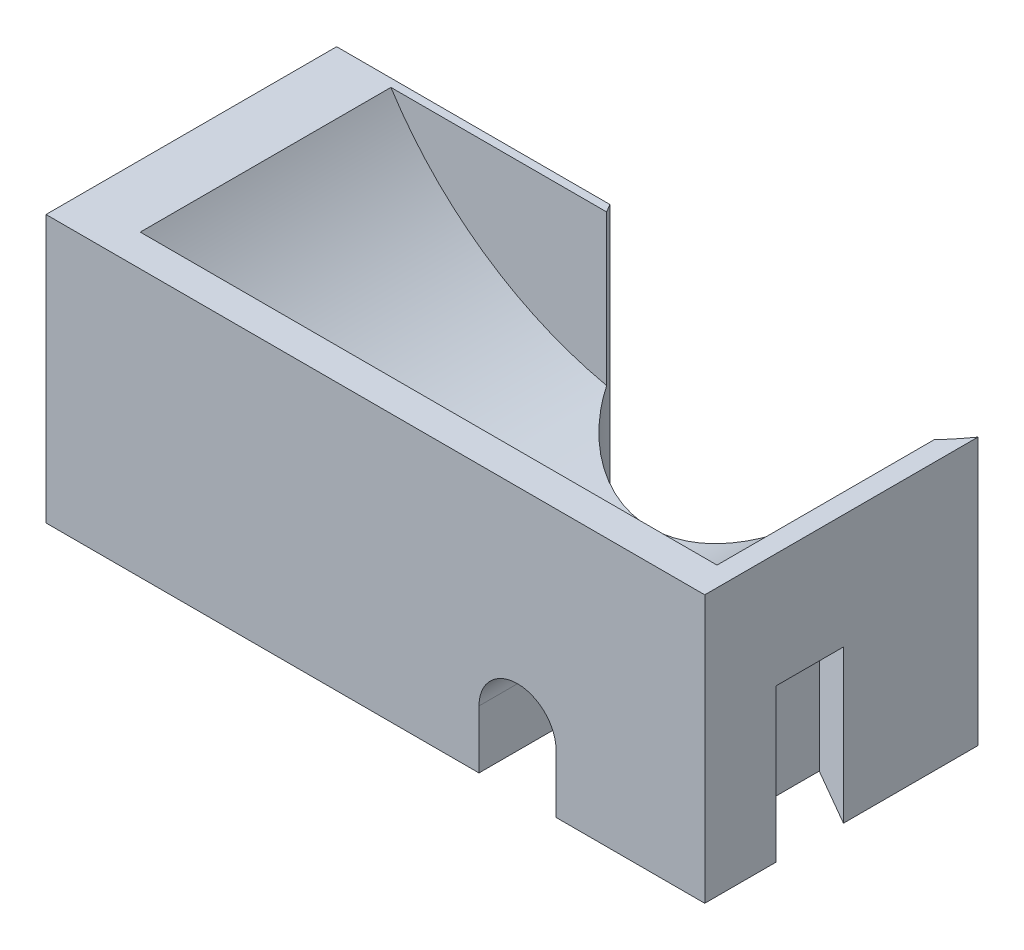
ISO-10303-21;
HEADER;
FILE_DESCRIPTION(('STEP AP214'),'2;1');
FILE_NAME('part.step','',(''),(''),'','','');
FILE_SCHEMA(('AUTOMOTIVE_DESIGN { 1 0 10303 214 1 1 1 1 }'));
ENDSEC;
DATA;
#1=APPLICATION_CONTEXT('core data for automotive mechanical design processes');
#2=APPLICATION_PROTOCOL_DEFINITION('international standard','automotive_design',2000,#1);
#3=PRODUCT_CONTEXT('',#1,'mechanical');
#4=PRODUCT('Part','Part','',(#3));
#5=PRODUCT_RELATED_PRODUCT_CATEGORY('part','',(#4));
#6=PRODUCT_DEFINITION_FORMATION('','',#4);
#7=PRODUCT_DEFINITION_CONTEXT('part definition',#1,'design');
#8=PRODUCT_DEFINITION('design','',#6,#7);
#9=PRODUCT_DEFINITION_SHAPE('','',#8);
#10=(LENGTH_UNIT() NAMED_UNIT(*) SI_UNIT(.MILLI.,.METRE.));
#11=(NAMED_UNIT(*) PLANE_ANGLE_UNIT() SI_UNIT($,.RADIAN.));
#12=(NAMED_UNIT(*) SI_UNIT($,.STERADIAN.) SOLID_ANGLE_UNIT());
#13=UNCERTAINTY_MEASURE_WITH_UNIT(LENGTH_MEASURE(1.E-05),#10,'distance_accuracy_value','');
#14=(GEOMETRIC_REPRESENTATION_CONTEXT(3) GLOBAL_UNCERTAINTY_ASSIGNED_CONTEXT((#13)) GLOBAL_UNIT_ASSIGNED_CONTEXT((#10,
#11,#12)) REPRESENTATION_CONTEXT('',''));
#15=CARTESIAN_POINT('',(0.,0.,0.));
#16=DIRECTION('',(0.,0.,1.));
#17=DIRECTION('',(1.,0.,0.));
#18=AXIS2_PLACEMENT_3D('',#15,#16,#17);
#19=CARTESIAN_POINT('',(219.202,88.9,-4.60248000000001));
#20=DIRECTION('',(-1.,0.,0.));
#21=DIRECTION('',(0.,0.,1.));
#22=AXIS2_PLACEMENT_3D('',#19,#20,#21);
#23=PLANE('',#22);
#24=DIRECTION('',(0.,0.,-1.));
#25=VECTOR('',#24,1.);
#26=CARTESIAN_POINT('',(219.202,0.,0.));
#27=LINE('',#26,#25);
#28=CARTESIAN_POINT('',(219.202,0.,-37.62248));
#29=VERTEX_POINT('',#28);
#30=CARTESIAN_POINT('',(219.202,0.,-61.3210026280625));
#31=VERTEX_POINT('',#30);
#32=EDGE_CURVE('E47',#29,#31,#27,.T.);
#33=ORIENTED_EDGE('',*,*,#32,.T.);
#34=DIRECTION('',(0.,1.,0.));
#35=VECTOR('',#34,1.);
#36=CARTESIAN_POINT('',(219.202,-12.7,-61.3210026280625));
#37=LINE('',#36,#35);
#38=CARTESIAN_POINT('',(219.202,50.8,-61.3210026280625));
#39=VERTEX_POINT('',#38);
#40=EDGE_CURVE('E11',#31,#39,#37,.T.);
#41=ORIENTED_EDGE('',*,*,#40,.T.);
#42=DIRECTION('',(0.,0.,1.));
#43=VECTOR('',#42,1.);
#44=CARTESIAN_POINT('',(219.202,50.8,-4.60248000000001));
#45=LINE('',#44,#43);
#46=CARTESIAN_POINT('',(219.202,50.8,-83.7739573719375));
#47=VERTEX_POINT('',#46);
#48=EDGE_CURVE('E58',#47,#39,#45,.T.);
#49=ORIENTED_EDGE('',*,*,#48,.F.);
#50=DIRECTION('',(0.,1.,0.));
#51=VECTOR('',#50,1.);
#52=CARTESIAN_POINT('',(219.202,88.9,-83.7739573719375));
#53=LINE('',#52,#51);
#54=CARTESIAN_POINT('',(219.202,0.,-83.7739573719375));
#55=VERTEX_POINT('',#54);
#56=EDGE_CURVE('E250',#55,#47,#53,.T.);
#57=ORIENTED_EDGE('',*,*,#56,.F.);
#58=CARTESIAN_POINT('',(219.202,0.,-128.546480448172));
#59=VERTEX_POINT('',#58);
#60=EDGE_CURVE('E338',#55,#59,#27,.T.);
#61=ORIENTED_EDGE('',*,*,#60,.T.);
#62=DIRECTION('',(0.,1.,0.));
#63=VECTOR('',#62,1.);
#64=CARTESIAN_POINT('',(219.202,-12.7,-128.546480448172));
#65=LINE('',#64,#63);
#66=CARTESIAN_POINT('',(219.202,50.8,-128.546480448172));
#67=VERTEX_POINT('',#66);
#68=EDGE_CURVE('E327',#67,#59,#65,.F.);
#69=ORIENTED_EDGE('',*,*,#68,.F.);
#70=CARTESIAN_POINT('',(219.202,88.9,-128.546480448172));
#71=VERTEX_POINT('',#70);
#72=EDGE_CURVE('E332',#71,#67,#65,.F.);
#73=ORIENTED_EDGE('',*,*,#72,.F.);
#74=DIRECTION('',(0.,0.,-1.));
#75=VECTOR('',#74,1.);
#76=CARTESIAN_POINT('',(219.202,88.9,0.));
#77=LINE('',#76,#75);
#78=CARTESIAN_POINT('',(219.202,88.9,-37.62248));
#79=VERTEX_POINT('',#78);
#80=EDGE_CURVE('E310',#79,#71,#77,.T.);
#81=ORIENTED_EDGE('',*,*,#80,.F.);
#82=DIRECTION('',(0.,1.,0.));
#83=VECTOR('',#82,1.);
#84=CARTESIAN_POINT('',(219.202,88.9,-37.62248));
#85=LINE('',#84,#83);
#86=CARTESIAN_POINT('',(219.202,50.8,-37.62248));
#87=VERTEX_POINT('',#86);
#88=EDGE_CURVE('E387',#87,#79,#85,.T.);
#89=ORIENTED_EDGE('',*,*,#88,.F.);
#90=EDGE_CURVE('E388',#29,#87,#85,.T.);
#91=ORIENTED_EDGE('',*,*,#90,.F.);
#92=EDGE_LOOP('',(#33,#41,#49,#57,#61,#69,#73,#81,#89,#91));
#93=FACE_BOUND('',#92,.T.);
#94=ADVANCED_FACE('F43',(#93),#23,.F.);
#95=CARTESIAN_POINT('',(0.,50.8,0.));
#96=DIRECTION('',(0.,-1.,0.));
#97=DIRECTION('',(0.,0.,-1.));
#98=AXIS2_PLACEMENT_3D('',#95,#96,#97);
#99=PLANE('',#98);
#100=DIRECTION('',(0.,0.,1.));
#101=VECTOR('',#100,1.);
#102=CARTESIAN_POINT('',(200.152,50.8,-94.77248));
#103=LINE('',#102,#101);
#104=CARTESIAN_POINT('',(200.152,50.8,-94.77248));
#105=VERTEX_POINT('',#104);
#106=CARTESIAN_POINT('',(200.152,50.8,-50.32248));
#107=VERTEX_POINT('',#106);
#108=EDGE_CURVE('E347',#105,#107,#103,.T.);
#109=ORIENTED_EDGE('',*,*,#108,.F.);
#110=DIRECTION('',(-0.866025403784436,0.,-0.500000000000004));
#111=VECTOR('',#110,1.);
#112=CARTESIAN_POINT('',(200.152,50.8,-94.77248));
#113=LINE('',#112,#111);
#114=EDGE_CURVE('E343',#47,#105,#113,.T.);
#115=ORIENTED_EDGE('',*,*,#114,.F.);
#116=ORIENTED_EDGE('',*,*,#48,.T.);
#117=DIRECTION('',(0.866025403784436,0.,-0.500000000000004));
#118=VECTOR('',#117,1.);
#119=CARTESIAN_POINT('',(200.152,50.8,-50.32248));
#120=LINE('',#119,#118);
#121=EDGE_CURVE('E341',#107,#39,#120,.T.);
#122=ORIENTED_EDGE('',*,*,#121,.F.);
#123=EDGE_LOOP('',(#109,#115,#116,#122));
#124=FACE_BOUND('',#123,.T.);
#125=ADVANCED_FACE('F45',(#124),#99,.T.);
#126=CARTESIAN_POINT('',(200.152,-12.7,-50.32248));
#127=DIRECTION('',(-0.500000000000004,0.,-0.866025403784436));
#128=DIRECTION('',(-0.866025403784436,0.,0.500000000000004));
#129=AXIS2_PLACEMENT_3D('',#126,#127,#128);
#130=PLANE('',#129);
#131=DIRECTION('',(0.866025403784436,0.,-0.500000000000004));
#132=VECTOR('',#131,1.);
#133=CARTESIAN_POINT('',(28.2477269692836,0.,48.9264983091322));
#134=LINE('',#133,#132);
#135=CARTESIAN_POINT('',(200.152,0.,-50.32248));
#136=VERTEX_POINT('',#135);
#137=EDGE_CURVE('E328',#136,#31,#134,.T.);
#138=ORIENTED_EDGE('',*,*,#137,.F.);
#139=DIRECTION('',(0.,1.,0.));
#140=VECTOR('',#139,1.);
#141=CARTESIAN_POINT('',(200.152,-12.7,-50.32248));
#142=LINE('',#141,#140);
#143=EDGE_CURVE('E348',#136,#107,#142,.T.);
#144=ORIENTED_EDGE('',*,*,#143,.T.);
#145=ORIENTED_EDGE('',*,*,#121,.T.);
#146=ORIENTED_EDGE('',*,*,#40,.F.);
#147=EDGE_LOOP('',(#138,#144,#145,#146));
#148=FACE_BOUND('',#147,.T.);
#149=ADVANCED_FACE('F433',(#148),#130,.T.);
#150=CARTESIAN_POINT('',(200.152,-12.7,-94.77248));
#151=DIRECTION('',(-0.500000000000004,0.,0.866025403784436));
#152=DIRECTION('',(0.866025403784436,0.,0.500000000000004));
#153=AXIS2_PLACEMENT_3D('',#150,#151,#152);
#154=PLANE('',#153);
#155=DIRECTION('',(-0.866025403784436,0.,-0.500000000000004));
#156=VECTOR('',#155,1.);
#157=CARTESIAN_POINT('',(91.0756876298274,0.,-157.747718309132));
#158=LINE('',#157,#156);
#159=CARTESIAN_POINT('',(200.152,0.,-94.77248));
#160=VERTEX_POINT('',#159);
#161=EDGE_CURVE('E335',#55,#160,#158,.T.);
#162=ORIENTED_EDGE('',*,*,#161,.F.);
#163=ORIENTED_EDGE('',*,*,#56,.T.);
#164=ORIENTED_EDGE('',*,*,#114,.T.);
#165=DIRECTION('',(0.,1.,0.));
#166=VECTOR('',#165,1.);
#167=CARTESIAN_POINT('',(200.152,-12.7,-94.77248));
#168=LINE('',#167,#166);
#169=EDGE_CURVE('E355',#160,#105,#168,.T.);
#170=ORIENTED_EDGE('',*,*,#169,.F.);
#171=EDGE_LOOP('',(#162,#163,#164,#170));
#172=FACE_BOUND('',#171,.T.);
#173=ADVANCED_FACE('F439',(#172),#154,.T.);
#174=CARTESIAN_POINT('',(200.152,-12.7,-94.77248));
#175=DIRECTION('',(1.,0.,0.));
#176=DIRECTION('',(0.,0.,-1.));
#177=AXIS2_PLACEMENT_3D('',#174,#175,#176);
#178=PLANE('',#177);
#179=DIRECTION('',(0.,0.,1.));
#180=VECTOR('',#179,1.);
#181=CARTESIAN_POINT('',(200.152,0.,0.));
#182=LINE('',#181,#180);
#183=EDGE_CURVE('E331',#160,#136,#182,.T.);
#184=ORIENTED_EDGE('',*,*,#183,.F.);
#185=ORIENTED_EDGE('',*,*,#169,.T.);
#186=ORIENTED_EDGE('',*,*,#108,.T.);
#187=ORIENTED_EDGE('',*,*,#143,.F.);
#188=EDGE_LOOP('',(#184,#185,#186,#187));
#189=FACE_BOUND('',#188,.T.);
#190=ADVANCED_FACE('F437',(#189),#178,.T.);
#191=CARTESIAN_POINT('',(0.,50.8,-134.33298));
#192=DIRECTION('',(0.,1.,0.));
#193=DIRECTION('',(0.,0.,1.));
#194=AXIS2_PLACEMENT_3D('',#191,#192,#193);
#195=PLANE('',#194);
#196=DIRECTION('',(-0.866025403784436,0.,0.500000000000004));
#197=VECTOR('',#196,1.);
#198=CARTESIAN_POINT('',(14.7024148251115,50.8,-108.867650528953));
#199=LINE('',#198,#197);
#200=CARTESIAN_POINT('',(19.05,50.8,-111.37773));
#201=VERTEX_POINT('',#200);
#202=CARTESIAN_POINT('',(0.,50.8,-100.379207371938));
#203=VERTEX_POINT('',#202);
#204=EDGE_CURVE('E224',#201,#203,#199,.T.);
#205=ORIENTED_EDGE('',*,*,#204,.F.);
#206=DIRECTION('',(0.,0.,-1.));
#207=VECTOR('',#206,1.);
#208=CARTESIAN_POINT('',(19.05,50.8,-134.33298));
#209=LINE('',#208,#207);
#210=CARTESIAN_POINT('',(19.05,50.8,-60.57773));
#211=VERTEX_POINT('',#210);
#212=EDGE_CURVE('E242',#211,#201,#209,.T.);
#213=ORIENTED_EDGE('',*,*,#212,.F.);
#214=DIRECTION('',(0.866025403784436,0.,0.500000000000004));
#215=VECTOR('',#214,1.);
#216=CARTESIAN_POINT('',(-27.1744600812362,50.8,-87.2654344710471));
#217=LINE('',#216,#215);
#218=CARTESIAN_POINT('',(0.,50.8,-71.5762526280625));
#219=VERTEX_POINT('',#218);
#220=EDGE_CURVE('E246',#219,#211,#217,.T.);
#221=ORIENTED_EDGE('',*,*,#220,.F.);
#222=DIRECTION('',(0.,0.,1.));
#223=VECTOR('',#222,1.);
#224=CARTESIAN_POINT('',(0.,50.8,-37.62248));
#225=LINE('',#224,#223);
#226=EDGE_CURVE('E234',#203,#219,#225,.T.);
#227=ORIENTED_EDGE('',*,*,#226,.F.);
#228=EDGE_LOOP('',(#205,#213,#221,#227));
#229=FACE_BOUND('',#228,.T.);
#230=ADVANCED_FACE('F275',(#229),#195,.F.);
#231=CARTESIAN_POINT('',(19.05,-12.7,-111.37773));
#232=DIRECTION('',(-0.500000000000004,0.,-0.866025403784436));
#233=DIRECTION('',(-0.866025403784436,0.,0.500000000000004));
#234=AXIS2_PLACEMENT_3D('',#231,#232,#233);
#235=PLANE('',#234);
#236=DIRECTION('',(0.866025403784436,0.,-0.500000000000004));
#237=VECTOR('',#236,1.);
#238=CARTESIAN_POINT('',(-43.4654717979223,0.,-75.2844055289527));
#239=LINE('',#238,#237);
#240=CARTESIAN_POINT('',(0.,0.,-100.379207371938));
#241=VERTEX_POINT('',#240);
#242=CARTESIAN_POINT('',(19.05,0.,-111.37773));
#243=VERTEX_POINT('',#242);
#244=EDGE_CURVE('E303',#241,#243,#239,.T.);
#245=ORIENTED_EDGE('',*,*,#244,.T.);
#246=DIRECTION('',(0.,1.,0.));
#247=VECTOR('',#246,1.);
#248=CARTESIAN_POINT('',(19.05,-12.7,-111.37773));
#249=LINE('',#248,#247);
#250=EDGE_CURVE('E311',#243,#201,#249,.T.);
#251=ORIENTED_EDGE('',*,*,#250,.T.);
#252=ORIENTED_EDGE('',*,*,#204,.T.);
#253=DIRECTION('',(0.,1.,0.));
#254=VECTOR('',#253,1.);
#255=CARTESIAN_POINT('',(0.,-12.7,-100.379207371938));
#256=LINE('',#255,#254);
#257=EDGE_CURVE('E308',#241,#203,#256,.T.);
#258=ORIENTED_EDGE('',*,*,#257,.F.);
#259=EDGE_LOOP('',(#245,#251,#252,#258));
#260=FACE_BOUND('',#259,.T.);
#261=ADVANCED_FACE('F462',(#260),#235,.F.);
#262=CARTESIAN_POINT('',(19.05,-12.7,-60.57773));
#263=DIRECTION('',(1.,0.,0.));
#264=DIRECTION('',(0.,0.,-1.));
#265=AXIS2_PLACEMENT_3D('',#262,#263,#264);
#266=PLANE('',#265);
#267=DIRECTION('',(0.,0.,1.));
#268=VECTOR('',#267,1.);
#269=CARTESIAN_POINT('',(19.05,0.,0.));
#270=LINE('',#269,#268);
#271=CARTESIAN_POINT('',(19.05,0.,-60.57773));
#272=VERTEX_POINT('',#271);
#273=EDGE_CURVE('E301',#243,#272,#270,.T.);
#274=ORIENTED_EDGE('',*,*,#273,.T.);
#275=DIRECTION('',(0.,1.,0.));
#276=VECTOR('',#275,1.);
#277=CARTESIAN_POINT('',(19.05,-12.7,-60.57773));
#278=LINE('',#277,#276);
#279=EDGE_CURVE('E313',#272,#211,#278,.T.);
#280=ORIENTED_EDGE('',*,*,#279,.T.);
#281=ORIENTED_EDGE('',*,*,#212,.T.);
#282=ORIENTED_EDGE('',*,*,#250,.F.);
#283=EDGE_LOOP('',(#274,#280,#281,#282));
#284=FACE_BOUND('',#283,.T.);
#285=ADVANCED_FACE('F458',(#284),#266,.F.);
#286=CARTESIAN_POINT('',(0.,-12.7,-71.5762526280625));
#287=DIRECTION('',(-0.500000000000004,0.,0.866025403784436));
#288=DIRECTION('',(0.866025403784436,0.,0.500000000000004));
#289=AXIS2_PLACEMENT_3D('',#286,#287,#288);
#290=PLANE('',#289);
#291=DIRECTION('',(-0.866025403784436,0.,-0.500000000000004));
#292=VECTOR('',#291,1.);
#293=CARTESIAN_POINT('',(30.9934265417976,0.,-53.6821894710466));
#294=LINE('',#293,#292);
#295=CARTESIAN_POINT('',(0.,0.,-71.5762526280625));
#296=VERTEX_POINT('',#295);
#297=EDGE_CURVE('E298',#272,#296,#294,.T.);
#298=ORIENTED_EDGE('',*,*,#297,.T.);
#299=DIRECTION('',(0.,1.,0.));
#300=VECTOR('',#299,1.);
#301=CARTESIAN_POINT('',(0.,-12.7,-71.5762526280625));
#302=LINE('',#301,#300);
#303=EDGE_CURVE('E296',#296,#219,#302,.T.);
#304=ORIENTED_EDGE('',*,*,#303,.T.);
#305=ORIENTED_EDGE('',*,*,#220,.T.);
#306=ORIENTED_EDGE('',*,*,#279,.F.);
#307=EDGE_LOOP('',(#298,#304,#305,#306));
#308=FACE_BOUND('',#307,.T.);
#309=ADVANCED_FACE('F455',(#308),#290,.F.);
#310=CARTESIAN_POINT('',(0.,0.,0.));
#311=DIRECTION('',(0.,-1.,0.));
#312=DIRECTION('',(0.,0.,-1.));
#313=AXIS2_PLACEMENT_3D('',#310,#311,#312);
#314=PLANE('',#313);
#315=DIRECTION('',(0.,0.,1.));
#316=VECTOR('',#315,1.);
#317=CARTESIAN_POINT('',(0.,0.,0.));
#318=LINE('',#317,#316);
#319=CARTESIAN_POINT('',(0.,0.,-134.33298));
#320=VERTEX_POINT('',#319);
#321=EDGE_CURVE('E305',#320,#241,#318,.T.);
#322=ORIENTED_EDGE('',*,*,#321,.F.);
#323=DIRECTION('',(-1.,0.,0.));
#324=VECTOR('',#323,1.);
#325=CARTESIAN_POINT('',(419.1,0.,-134.33298));
#326=LINE('',#325,#324);
#327=CARTESIAN_POINT('',(90.9178858384925,0.,-134.33298));
#328=VERTEX_POINT('',#327);
#329=EDGE_CURVE('E391',#328,#320,#326,.T.);
#330=ORIENTED_EDGE('',*,*,#329,.F.);
#331=CARTESIAN_POINT('',(156.909021606867,0.,-172.43298));
#332=DIRECTION('',(0.,-1.,0.));
#333=DIRECTION('',(0.,0.,-1.));
#334=AXIS2_PLACEMENT_3D('',#331,#332,#333);
#335=CIRCLE('',#334,76.2);
#336=CARTESIAN_POINT('',(144.082021606867,0.,-97.3203441056313));
#337=VERTEX_POINT('',#336);
#338=EDGE_CURVE('E370',#337,#328,#335,.T.);
#339=ORIENTED_EDGE('',*,*,#338,.F.);
#340=DIRECTION('',(0.,0.,-1.));
#341=VECTOR('',#340,1.);
#342=CARTESIAN_POINT('',(144.082021606867,0.,33.9832349236573));
#343=LINE('',#342,#341);
#344=CARTESIAN_POINT('',(144.082021606867,0.,-37.62248));
#345=VERTEX_POINT('',#344);
#346=EDGE_CURVE('E380',#345,#337,#343,.T.);
#347=ORIENTED_EDGE('',*,*,#346,.F.);
#348=DIRECTION('',(1.,0.,0.));
#349=VECTOR('',#348,1.);
#350=CARTESIAN_POINT('',(0.,0.,-37.62248));
#351=LINE('',#350,#349);
#352=CARTESIAN_POINT('',(0.,0.,-37.62248));
#353=VERTEX_POINT('',#352);
#354=EDGE_CURVE('E385',#353,#345,#351,.T.);
#355=ORIENTED_EDGE('',*,*,#354,.F.);
#356=DIRECTION('',(0.,0.,1.));
#357=VECTOR('',#356,1.);
#358=CARTESIAN_POINT('',(0.,0.,0.));
#359=LINE('',#358,#357);
#360=EDGE_CURVE('E297',#296,#353,#359,.T.);
#361=ORIENTED_EDGE('',*,*,#360,.F.);
#362=ORIENTED_EDGE('',*,*,#297,.F.);
#363=ORIENTED_EDGE('',*,*,#273,.F.);
#364=ORIENTED_EDGE('',*,*,#244,.F.);
#365=EDGE_LOOP('',(#322,#330,#339,#347,#355,#361,#362,#363,#364));
#366=FACE_BOUND('',#365,.T.);
#367=ADVANCED_FACE('F418',(#366),#314,.T.);
#368=CARTESIAN_POINT('',(144.082021606867,0.,33.9832349236573));
#369=DIRECTION('',(-1.,0.,0.));
#370=DIRECTION('',(0.,0.,1.));
#371=AXIS2_PLACEMENT_3D('',#368,#369,#370);
#372=PLANE('',#371);
#373=ORIENTED_EDGE('',*,*,#346,.T.);
#374=DIRECTION('',(0.,1.,0.));
#375=VECTOR('',#374,1.);
#376=CARTESIAN_POINT('',(144.082021606867,-12.7,-97.3203441056313));
#377=LINE('',#376,#375);
#378=CARTESIAN_POINT('',(144.082021606867,19.3163774202701,-97.3203441056313));
#379=VERTEX_POINT('',#378);
#380=EDGE_CURVE('E263',#337,#379,#377,.T.);
#381=ORIENTED_EDGE('',*,*,#380,.T.);
#382=DIRECTION('',(0.,0.,-1.));
#383=VECTOR('',#382,1.);
#384=CARTESIAN_POINT('',(144.082021606867,19.3163774202701,33.9832349236573));
#385=LINE('',#384,#383);
#386=CARTESIAN_POINT('',(144.082021606867,19.3163774202701,-37.62248));
#387=VERTEX_POINT('',#386);
#388=EDGE_CURVE('E377',#387,#379,#385,.T.);
#389=ORIENTED_EDGE('',*,*,#388,.F.);
#390=DIRECTION('',(0.,-1.,0.));
#391=VECTOR('',#390,1.);
#392=CARTESIAN_POINT('',(144.082021606867,0.,-37.62248));
#393=LINE('',#392,#391);
#394=EDGE_CURVE('E396',#387,#345,#393,.T.);
#395=ORIENTED_EDGE('',*,*,#394,.T.);
#396=EDGE_LOOP('',(#373,#381,#389,#395));
#397=FACE_BOUND('',#396,.T.);
#398=ADVANCED_FACE('F411',(#397),#372,.F.);
#399=CARTESIAN_POINT('',(156.909021606867,19.3163774202701,33.9832349236573));
#400=DIRECTION('',(0.,0.,-1.));
#401=DIRECTION('',(-1.,0.,0.));
#402=AXIS2_PLACEMENT_3D('',#399,#400,#401);
#403=CYLINDRICAL_SURFACE('',#402,12.827);
#404=ORIENTED_EDGE('',*,*,#388,.T.);
#405=CARTESIAN_POINT('',(144.082021606867,19.3163774202701,-97.3203441056313));
#406=CARTESIAN_POINT('',(144.081980002003,19.674417318807,-97.3203706950546));
#407=CARTESIAN_POINT('',(144.0970107518,20.0324477808746,-97.3177850017572));
#408=CARTESIAN_POINT('',(144.156913806363,20.7458963548096,-97.3075818232591));
#409=CARTESIAN_POINT('',(144.201783092249,21.1013147272746,-97.2999648470934));
#410=CARTESIAN_POINT('',(144.320983685887,21.8065665506759,-97.2799046767254));
#411=CARTESIAN_POINT('',(144.395277131997,22.1564065801217,-97.2674676851347));
#412=CARTESIAN_POINT('',(144.57274509734,22.8484886445516,-97.2381369776627));
#413=CARTESIAN_POINT('',(144.675919594239,23.1907306854114,-97.2212432652281));
#414=CARTESIAN_POINT('',(144.910400846502,23.8652852493027,-97.1834804928675));
#415=CARTESIAN_POINT('',(145.041713165892,24.1975957936311,-97.1626106467844));
#416=CARTESIAN_POINT('',(145.331491900473,24.849921657921,-97.1174948904797));
#417=CARTESIAN_POINT('',(145.489958609173,25.1699368449382,-97.0932489437671));
#418=CARTESIAN_POINT('',(145.832905135481,25.7954826165946,-97.0420675206401));
#419=CARTESIAN_POINT('',(146.017384928444,26.1010132149562,-97.0151320467739));
#420=CARTESIAN_POINT('',(146.411059133808,26.6955251645597,-96.9593270390223));
#421=CARTESIAN_POINT('',(146.620253627969,26.9845064610502,-96.9304574987391));
#422=CARTESIAN_POINT('',(147.063879195269,27.5464677264759,-96.8713252255254));
#423=CARTESIAN_POINT('',(147.298518137886,27.8192825563055,-96.841052386714));
#424=CARTESIAN_POINT('',(147.789860293263,28.3442273487511,-96.7802063602077));
#425=CARTESIAN_POINT('',(148.04656366612,28.5963571612547,-96.7496331703351));
#426=CARTESIAN_POINT('',(148.580314956433,29.0782351957301,-96.6890378095051));
#427=CARTESIAN_POINT('',(148.857365957908,29.3079800125601,-96.6590157229421));
#428=CARTESIAN_POINT('',(149.429884378414,29.7434473754043,-96.60036634391));
#429=CARTESIAN_POINT('',(149.725351821388,29.9491698901865,-96.5717390532544));
#430=CARTESIAN_POINT('',(150.334531174701,30.3363156833559,-96.5165116787527));
#431=CARTESIAN_POINT('',(150.648343272254,30.5175832822997,-96.4899250082875));
#432=CARTESIAN_POINT('',(151.290368896252,30.8530080850057,-96.4397276326144));
#433=CARTESIAN_POINT('',(151.618582500754,31.0071651418069,-96.416116943539));
#434=CARTESIAN_POINT('',(152.287054101712,31.2872023059767,-96.3725462783224));
#435=CARTESIAN_POINT('',(152.627310791014,31.4130854713607,-96.3525859074177));
#436=CARTESIAN_POINT('',(153.31746406319,31.63563466525,-96.316883839556));
#437=CARTESIAN_POINT('',(153.667360546471,31.7323009954817,-96.3011420990327));
#438=CARTESIAN_POINT('',(154.370934479109,31.894897997159,-96.2744553628301));
#439=CARTESIAN_POINT('',(154.724545519948,31.9611089043888,-96.2634666901631));
#440=CARTESIAN_POINT('',(155.436195289238,32.0636103170679,-96.2463836879321));
#441=CARTESIAN_POINT('',(155.79423399294,32.0999009896953,-96.2402893310215));
#442=CARTESIAN_POINT('',(156.51213140006,32.1422768464238,-96.2331681297441));
#443=CARTESIAN_POINT('',(156.871990035173,32.1483631558581,-96.2321410965825));
#444=CARTESIAN_POINT('',(157.5909238785,32.1302852698232,-96.2351832737623));
#445=CARTESIAN_POINT('',(157.949999090984,32.1061212396345,-96.2392524562591));
#446=CARTESIAN_POINT('',(158.661136806694,32.0281308598088,-96.2523046863911));
#447=CARTESIAN_POINT('',(159.013233501978,31.9746074116959,-96.2612375485186));
#448=CARTESIAN_POINT('',(159.711614043232,31.8385165137609,-96.2837348258339));
#449=CARTESIAN_POINT('',(160.057897934885,31.7559492923077,-96.2972992046043));
#450=CARTESIAN_POINT('',(160.742233703808,31.5623915697681,-96.3286843067033));
#451=CARTESIAN_POINT('',(161.080285463097,31.4514006615825,-96.3465050909942));
#452=CARTESIAN_POINT('',(161.745814117451,31.2018170490258,-96.3859118604959));
#453=CARTESIAN_POINT('',(162.073290938018,31.0632241502532,-96.4074978722253));
#454=CARTESIAN_POINT('',(162.716932138441,30.7587305001128,-96.4539514333826));
#455=CARTESIAN_POINT('',(163.03303648369,30.5927051285241,-96.4788338504528));
#456=CARTESIAN_POINT('',(163.650156524544,30.2349959107583,-96.5311156634102));
#457=CARTESIAN_POINT('',(163.951172186216,30.0433120068828,-96.5585150649573));
#458=CARTESIAN_POINT('',(164.536092759522,29.635621816494,-96.6150788316126));
#459=CARTESIAN_POINT('',(164.819997103327,29.4196147235119,-96.6442432552278));
#460=CARTESIAN_POINT('',(165.36877837883,28.9647689358276,-96.7035359049911));
#461=CARTESIAN_POINT('',(165.63365517885,28.7259300831471,-96.7336641378071));
#462=CARTESIAN_POINT('',(166.145724271424,28.2239788929368,-96.7944274654638));
#463=CARTESIAN_POINT('',(166.392659842595,27.9606047884149,-96.8250642450063));
#464=CARTESIAN_POINT('',(166.863500675014,27.4139334601393,-96.8856126991821));
#465=CARTESIAN_POINT('',(167.087405572806,27.1306359220837,-96.9155243623662));
#466=CARTESIAN_POINT('',(167.510674621852,26.545980759162,-96.9737816043461));
#467=CARTESIAN_POINT('',(167.710031384919,26.2446177375523,-97.0021267102514));
#468=CARTESIAN_POINT('',(168.082695047787,25.6259999752959,-97.0564286392203));
#469=CARTESIAN_POINT('',(168.256002781154,25.3087457435989,-97.0823855386959));
#470=CARTESIAN_POINT('',(168.575593747722,24.6599731149103,-97.1312052003055));
#471=CARTESIAN_POINT('',(168.721828665921,24.3284304934294,-97.1540624115648));
#472=CARTESIAN_POINT('',(168.985796829473,23.6539539872622,-97.1959587034029));
#473=CARTESIAN_POINT('',(169.103530520491,23.3110202807909,-97.2149978436831));
#474=CARTESIAN_POINT('',(169.309467864939,22.6166571966926,-97.2486743409765));
#475=CARTESIAN_POINT('',(169.397708038198,22.2652389077223,-97.2633171393788));
#476=CARTESIAN_POINT('',(169.544138937871,21.5561767011553,-97.2877916830802));
#477=CARTESIAN_POINT('',(169.60234407763,21.1985358550043,-97.2976257359023));
#478=CARTESIAN_POINT('',(169.675543087503,20.5862954971143,-97.3100349567253));
#479=CARTESIAN_POINT('',(169.698234550896,20.3326153768816,-97.3138982437244));
#480=CARTESIAN_POINT('',(169.728464547253,19.8247573978499,-97.3190535843424));
#481=CARTESIAN_POINT('',(169.7360285626,19.5705810992626,-97.3203499619171));
#482=CARTESIAN_POINT('',(169.736021606867,19.3163774202701,-97.3203441056313));
#483=B_SPLINE_CURVE_WITH_KNOTS('',3,(#405,#406,#407,#408,#409,#410,#411,#412,#413,#414,#415,
#416,#417,#418,#419,#420,#421,#422,#423,#424,#425,#426,#427,#428,#429,#430,#431,#432,#433,#434,
#435,#436,#437,#438,#439,#440,#441,#442,#443,#444,#445,#446,#447,#448,#449,#450,#451,#452,#453,
#454,#455,#456,#457,#458,#459,#460,#461,#462,#463,#464,#465,#466,#467,#468,#469,#470,#471,#472,
#473,#474,#475,#476,#477,#478,#479,#480,#481,#482),.UNSPECIFIED.,.F.,.F.,(4,2,2,2,2,2,2,2,2,2,2,
2,2,2,2,2,2,2,2,2,2,2,2,2,2,2,2,2,2,2,2,2,2,2,2,2,2,2,4),(0.,1.07378096511542,2.14745330816589,
3.21974856485939,4.2920429922878,5.36454965316369,6.43706790731188,7.50958514535476,
8.58210593148538,9.66416388825713,10.7462296969008,11.8284598501728,12.9106914104579,
13.9995164755259,15.0883474427232,16.177060588608,17.2657624908149,18.3442357893337,
19.4227030618884,20.5011301533595,21.5795513525917,22.647050198412,23.7145406507556,
24.7820463931225,25.8495596542287,26.9220629260686,27.9945686096905,29.0671098641902,
30.1396585403868,31.2253609359485,32.3110804628349,33.3971259613404,34.4831366991495,
35.5710672664562,36.6589808209614,37.745542251605,38.8315817723065,39.5953106941441,
40.3577520173767),.UNSPECIFIED.);
#484=CARTESIAN_POINT('',(169.736021606867,19.3163774202701,-97.3203441056313));
#485=VERTEX_POINT('',#484);
#486=EDGE_CURVE('E254',#379,#485,#483,.T.);
#487=ORIENTED_EDGE('',*,*,#486,.T.);
#488=DIRECTION('',(0.,0.,-1.));
#489=VECTOR('',#488,1.);
#490=CARTESIAN_POINT('',(169.736021606867,19.3163774202701,33.9832349236573));
#491=LINE('',#490,#489);
#492=CARTESIAN_POINT('',(169.736021606867,19.3163774202701,-37.62248));
#493=VERTEX_POINT('',#492);
#494=EDGE_CURVE('E201',#493,#485,#491,.T.);
#495=ORIENTED_EDGE('',*,*,#494,.F.);
#496=CARTESIAN_POINT('',(156.909021606867,19.3163774202701,-37.62248));
#497=DIRECTION('',(0.,0.,1.));
#498=DIRECTION('',(1.,0.,0.));
#499=AXIS2_PLACEMENT_3D('',#496,#497,#498);
#500=CIRCLE('',#499,12.827);
#501=EDGE_CURVE('E394',#493,#387,#500,.T.);
#502=ORIENTED_EDGE('',*,*,#501,.T.);
#503=EDGE_LOOP('',(#404,#487,#495,#502));
#504=FACE_BOUND('',#503,.T.);
#505=ADVANCED_FACE('F265',(#504),#403,.F.);
#506=CARTESIAN_POINT('',(0.,-12.7,-100.379207371938));
#507=DIRECTION('',(1.,0.,0.));
#508=DIRECTION('',(0.,0.,-1.));
#509=AXIS2_PLACEMENT_3D('',#506,#507,#508);
#510=PLANE('',#509);
#511=ORIENTED_EDGE('',*,*,#321,.T.);
#512=ORIENTED_EDGE('',*,*,#257,.T.);
#513=ORIENTED_EDGE('',*,*,#226,.T.);
#514=ORIENTED_EDGE('',*,*,#303,.F.);
#515=ORIENTED_EDGE('',*,*,#360,.T.);
#516=DIRECTION('',(0.,1.,0.));
#517=VECTOR('',#516,1.);
#518=CARTESIAN_POINT('',(0.,0.,-37.62248));
#519=LINE('',#518,#517);
#520=CARTESIAN_POINT('',(0.,88.9,-37.62248));
#521=VERTEX_POINT('',#520);
#522=EDGE_CURVE('E293',#353,#521,#519,.T.);
#523=ORIENTED_EDGE('',*,*,#522,.T.);
#524=DIRECTION('',(0.,0.,1.));
#525=VECTOR('',#524,1.);
#526=CARTESIAN_POINT('',(0.,88.9,0.));
#527=LINE('',#526,#525);
#528=CARTESIAN_POINT('',(0.,88.9,-134.33298));
#529=VERTEX_POINT('',#528);
#530=EDGE_CURVE('E219',#529,#521,#527,.T.);
#531=ORIENTED_EDGE('',*,*,#530,.F.);
#532=DIRECTION('',(0.,-1.,0.));
#533=VECTOR('',#532,1.);
#534=CARTESIAN_POINT('',(0.,0.,-134.33298));
#535=LINE('',#534,#533);
#536=EDGE_CURVE('E287',#529,#320,#535,.T.);
#537=ORIENTED_EDGE('',*,*,#536,.T.);
#538=EDGE_LOOP('',(#511,#512,#513,#514,#515,#523,#531,#537));
#539=FACE_BOUND('',#538,.T.);
#540=ADVANCED_FACE('F426',(#539),#510,.F.);
#541=CARTESIAN_POINT('',(0.,0.,-134.33298));
#542=DIRECTION('',(0.,0.,-1.));
#543=DIRECTION('',(-1.,0.,0.));
#544=AXIS2_PLACEMENT_3D('',#541,#542,#543);
#545=PLANE('',#544);
#546=ORIENTED_EDGE('',*,*,#536,.F.);
#547=DIRECTION('',(1.,0.,0.));
#548=VECTOR('',#547,1.);
#549=CARTESIAN_POINT('',(419.1,88.9,-134.33298));
#550=LINE('',#549,#548);
#551=CARTESIAN_POINT('',(90.9178858384925,88.9,-134.33298));
#552=VERTEX_POINT('',#551);
#553=EDGE_CURVE('E222',#529,#552,#550,.T.);
#554=ORIENTED_EDGE('',*,*,#553,.T.);
#555=DIRECTION('',(0.,1.,0.));
#556=VECTOR('',#555,1.);
#557=CARTESIAN_POINT('',(90.9178858384925,-12.7,-134.33298));
#558=LINE('',#557,#556);
#559=EDGE_CURVE('E251',#328,#552,#558,.T.);
#560=ORIENTED_EDGE('',*,*,#559,.F.);
#561=ORIENTED_EDGE('',*,*,#329,.T.);
#562=EDGE_LOOP('',(#546,#554,#560,#561));
#563=FACE_BOUND('',#562,.T.);
#564=ADVANCED_FACE('F422',(#563),#545,.T.);
#565=CARTESIAN_POINT('',(116.716649899794,150.061217687717,-131.63296));
#566=DIRECTION('',(0.,0.,-1.));
#567=DIRECTION('',(-1.,0.,0.));
#568=AXIS2_PLACEMENT_3D('',#565,#566,#567);
#569=PLANE('',#568);
#570=DIRECTION('',(0.,1.,0.));
#571=VECTOR('',#570,1.);
#572=CARTESIAN_POINT('',(92.552216465533,-12.7,-131.63296));
#573=LINE('',#572,#571);
#574=CARTESIAN_POINT('',(92.552216465533,38.8645476800172,-131.63296));
#575=VERTEX_POINT('',#574);
#576=CARTESIAN_POINT('',(92.552216465533,88.9,-131.63296));
#577=VERTEX_POINT('',#576);
#578=EDGE_CURVE('E217',#575,#577,#573,.T.);
#579=ORIENTED_EDGE('',*,*,#578,.T.);
#580=DIRECTION('',(1.,0.,0.));
#581=VECTOR('',#580,1.);
#582=CARTESIAN_POINT('',(0.,88.9,-131.63296));
#583=LINE('',#582,#581);
#584=CARTESIAN_POINT('',(20.7587178933372,88.9,-131.63296));
#585=VERTEX_POINT('',#584);
#586=EDGE_CURVE('E209',#585,#577,#583,.T.);
#587=ORIENTED_EDGE('',*,*,#586,.F.);
#588=CARTESIAN_POINT('',(116.716649899794,150.061217687717,-131.63296));
#589=DIRECTION('',(0.,0.,-1.));
#590=DIRECTION('',(-1.,0.,0.));
#591=AXIS2_PLACEMENT_3D('',#588,#589,#590);
#592=CIRCLE('',#591,113.792);
#593=EDGE_CURVE('E191',#575,#585,#592,.T.);
#594=ORIENTED_EDGE('',*,*,#593,.F.);
#595=EDGE_LOOP('',(#579,#587,#594));
#596=FACE_BOUND('',#595,.T.);
#597=ADVANCED_FACE('F216',(#596),#569,.F.);
#598=CARTESIAN_POINT('',(116.716649899794,150.061217687717,-48.23206));
#599=DIRECTION('',(0.,0.,-1.));
#600=DIRECTION('',(-1.,0.,0.));
#601=AXIS2_PLACEMENT_3D('',#598,#599,#600);
#602=PLANE('',#601);
#603=CARTESIAN_POINT('',(116.716649899794,150.061217687717,-48.23206));
#604=DIRECTION('',(0.,0.,-1.));
#605=DIRECTION('',(-1.,0.,0.));
#606=AXIS2_PLACEMENT_3D('',#603,#604,#605);
#607=CIRCLE('',#606,113.792);
#608=CARTESIAN_POINT('',(20.7587178933372,88.9,-48.23206));
#609=VERTEX_POINT('',#608);
#610=CARTESIAN_POINT('',(212.67458190625,88.9,-48.23206));
#611=VERTEX_POINT('',#610);
#612=EDGE_CURVE('E202',#609,#611,#607,.F.);
#613=ORIENTED_EDGE('',*,*,#612,.F.);
#614=DIRECTION('',(1.,0.,0.));
#615=VECTOR('',#614,1.);
#616=CARTESIAN_POINT('',(0.,88.9,-48.23206));
#617=LINE('',#616,#615);
#618=EDGE_CURVE('E212',#609,#611,#617,.T.);
#619=ORIENTED_EDGE('',*,*,#618,.T.);
#620=EDGE_LOOP('',(#613,#619));
#621=FACE_BOUND('',#620,.T.);
#622=ADVANCED_FACE('F473',(#621),#602,.T.);
#623=CARTESIAN_POINT('',(116.716649899794,150.061217687717,164.918088997706));
#624=DIRECTION('',(0.,0.,-1.));
#625=DIRECTION('',(-1.,0.,0.));
#626=AXIS2_PLACEMENT_3D('',#623,#624,#625);
#627=CYLINDRICAL_SURFACE('',#626,113.792);
#628=ORIENTED_EDGE('',*,*,#612,.T.);
#629=DIRECTION('',(0.,0.,-1.));
#630=VECTOR('',#629,1.);
#631=CARTESIAN_POINT('',(212.67458190625,88.9,164.918088997706));
#632=LINE('',#631,#630);
#633=CARTESIAN_POINT('',(212.67458190625,88.9,-120.503775456739));
#634=VERTEX_POINT('',#633);
#635=EDGE_CURVE('E214',#611,#634,#632,.T.);
#636=ORIENTED_EDGE('',*,*,#635,.T.);
#637=CARTESIAN_POINT('',(212.67458190625,88.9000000000001,-120.503775456739));
#638=CARTESIAN_POINT('',(211.928492796293,87.7294805860758,-119.702579581009));
#639=CARTESIAN_POINT('',(211.158284127187,86.5682863302019,-118.910082295883));
#640=CARTESIAN_POINT('',(209.568771892287,84.2656115115922,-117.345459322271));
#641=CARTESIAN_POINT('',(208.749460604929,83.1241340859478,-116.57333686544));
#642=CARTESIAN_POINT('',(207.059359497767,80.8599648181193,-115.051104976623));
#643=CARTESIAN_POINT('',(206.188465760537,79.7373171778797,-114.301044875265));
#644=CARTESIAN_POINT('',(204.396202311889,77.5150031453056,-112.828003693116));
#645=CARTESIAN_POINT('',(203.474834832317,76.4153357397974,-112.105021417374));
#646=CARTESIAN_POINT('',(200.614492523057,73.1309990641837,-109.96716338726));
#647=CARTESIAN_POINT('',(198.596302564551,70.9839283191786,-108.598886603519));
#648=CARTESIAN_POINT('',(194.349183051765,66.8106300686646,-106.018818641407));
#649=CARTESIAN_POINT('',(192.120444211661,64.7842958632658,-104.806888155487));
#650=CARTESIAN_POINT('',(188.149872436826,61.4583158375654,-102.907869226549));
#651=CARTESIAN_POINT('',(186.461473325083,60.1224130592551,-102.172145850202));
#652=CARTESIAN_POINT('',(182.982808858342,57.5295048971237,-100.808361977266));
#653=CARTESIAN_POINT('',(181.192546248287,56.2724973892083,-100.180298581362));
#654=CARTESIAN_POINT('',(178.437597861052,54.4560368380096,-99.3311269802607));
#655=CARTESIAN_POINT('',(177.509011875582,53.8628258420668,-99.0638605686569));
#656=CARTESIAN_POINT('',(175.628664931925,52.6999567612559,-98.5617299190749));
#657=CARTESIAN_POINT('',(174.676906392316,52.1302962349687,-98.3268623164636));
#658=CARTESIAN_POINT('',(172.751093491645,51.0157816537693,-97.8914242651801));
#659=CARTESIAN_POINT('',(171.77703617998,50.4709309105658,-97.6908583854486));
#660=CARTESIAN_POINT('',(169.808114715585,49.4075178871251,-97.326018430803));
#661=CARTESIAN_POINT('',(168.813252900177,48.8889526759636,-97.1617403027948));
#662=CARTESIAN_POINT('',(166.79221053757,47.873392685249,-96.8696465237655));
#663=CARTESIAN_POINT('',(165.765798428806,47.3767269281094,-96.7422867299355));
#664=CARTESIAN_POINT('',(163.694955079937,46.4129548909965,-96.5286020618399));
#665=CARTESIAN_POINT('',(162.6505238034,45.9458486707967,-96.4422772705504));
#666=CARTESIAN_POINT('',(160.545712938982,45.0424378733098,-96.3125079715528));
#667=CARTESIAN_POINT('',(159.485332598498,44.6061347551216,-96.269065493855));
#668=CARTESIAN_POINT('',(157.351075218012,43.7655069284862,-96.2267876113686));
#669=CARTESIAN_POINT('',(156.277198237732,43.3611820785933,-96.2279520092648));
#670=CARTESIAN_POINT('',(154.119039581091,42.5856635867212,-96.2764273739454));
#671=CARTESIAN_POINT('',(153.034762207401,42.2144568473557,-96.3237200090755));
#672=CARTESIAN_POINT('',(150.858280494393,41.5058027392134,-96.4657646081829));
#673=CARTESIAN_POINT('',(149.766076068606,41.1683557392923,-96.5605170906341));
#674=CARTESIAN_POINT('',(147.577059091949,40.5278678386764,-96.798553940888));
#675=CARTESIAN_POINT('',(146.480247298888,40.2248214932168,-96.9418306141826));
#676=CARTESIAN_POINT('',(144.28516928036,39.6534188586538,-97.2777341243821));
#677=CARTESIAN_POINT('',(143.186903123192,39.3850609950866,-97.4703587202666));
#678=CARTESIAN_POINT('',(141.158915524214,38.9211856507027,-97.8724366959599));
#679=CARTESIAN_POINT('',(140.228913119661,38.7207946520399,-98.0748983636884));
#680=CARTESIAN_POINT('',(138.372429909961,38.344865603754,-98.5158309733808));
#681=CARTESIAN_POINT('',(137.445949045533,38.169327133943,-98.7543013063962));
#682=CARTESIAN_POINT('',(135.598742023044,37.8428346310483,-99.2672044065705));
#683=CARTESIAN_POINT('',(134.678015254368,37.6918779452715,-99.5416332875605));
#684=CARTESIAN_POINT('',(132.84431737709,37.4140804854987,-100.126299240706));
#685=CARTESIAN_POINT('',(131.931346336623,37.2872399231569,-100.436536627095));
#686=CARTESIAN_POINT('',(130.115483314359,37.057112004185,-101.092402871214));
#687=CARTESIAN_POINT('',(129.21258871522,36.9538183891445,-101.438022289483));
#688=CARTESIAN_POINT('',(127.418545440306,36.7699916874444,-102.164292591262));
#689=CARTESIAN_POINT('',(126.527397979951,36.6894609385969,-102.544947067658));
#690=CARTESIAN_POINT('',(124.758969341656,36.550306442619,-103.340620393923));
#691=CARTESIAN_POINT('',(123.881686606721,36.491680218648,-103.755635352017));
#692=CARTESIAN_POINT('',(122.142624804917,36.3953189180812,-104.619409461831));
#693=CARTESIAN_POINT('',(121.280847208828,36.3575858133549,-105.068171794055));
#694=CARTESIAN_POINT('',(119.623605210956,36.3035092607775,-105.971888668637));
#695=CARTESIAN_POINT('',(118.827174595935,36.2860619428947,-106.425007774889));
#696=CARTESIAN_POINT('',(117.250971339981,36.2677423672626,-107.359800371595));
#697=CARTESIAN_POINT('',(116.471200124381,36.2668715221246,-107.841476292092));
#698=CARTESIAN_POINT('',(114.929715153128,36.2806388963227,-108.832529893443));
#699=CARTESIAN_POINT('',(114.167999494149,36.2952754734433,-109.34190463561));
#700=CARTESIAN_POINT('',(112.663685523156,36.3389278144696,-110.387595898035));
#701=CARTESIAN_POINT('',(111.921088818599,36.3679447833032,-110.923914672539));
#702=CARTESIAN_POINT('',(109.723255341219,36.4748508176007,-112.572334549233));
#703=CARTESIAN_POINT('',(108.298165601803,36.5725927516827,-113.723776750201));
#704=CARTESIAN_POINT('',(105.536930092938,36.811254263225,-116.124053351709));
#705=CARTESIAN_POINT('',(104.200774793538,36.9521692052974,-117.372877285868));
#706=CARTESIAN_POINT('',(101.931244807374,37.2295373168757,-119.652135244658));
#707=CARTESIAN_POINT('',(100.977839737357,37.3590312319459,-120.663572275663));
#708=CARTESIAN_POINT('',(99.1287567160931,37.6327578509029,-122.735807631456));
#709=CARTESIAN_POINT('',(98.2330713872355,37.7769886650342,-123.796599617837));
#710=CARTESIAN_POINT('',(96.5038666125354,38.0753670227302,-125.961787631826));
#711=CARTESIAN_POINT('',(95.670192541187,38.2294879840982,-127.066063929725));
#712=CARTESIAN_POINT('',(94.0644594590359,38.5436576310122,-129.31785255249));
#713=CARTESIAN_POINT('',(93.2924048050538,38.70370673454,-130.46536792616));
#714=CARTESIAN_POINT('',(92.5522164655331,38.8645476800172,-131.63296));
#715=B_SPLINE_CURVE_WITH_KNOTS('',3,(#637,#638,#639,#640,#641,#642,#643,#644,#645,#646,#647,
#648,#649,#650,#651,#652,#653,#654,#655,#656,#657,#658,#659,#660,#661,#662,#663,#664,#665,#666,
#667,#668,#669,#670,#671,#672,#673,#674,#675,#676,#677,#678,#679,#680,#681,#682,#683,#684,#685,
#686,#687,#688,#689,#690,#691,#692,#693,#694,#695,#696,#697,#698,#699,#700,#701,#702,#703,#704,
#705,#706,#707,#708,#709,#710,#711,#712,#713,#714),.UNSPECIFIED.,.F.,.F.,(4,2,2,2,2,2,2,2,2,2,2,
2,2,2,2,2,2,2,2,2,2,2,2,2,2,2,2,2,2,2,2,2,2,2,2,2,2,2,4),(0.,4.8079931561985,9.61674438064049,
14.4355365015815,19.2541157170572,28.9885044481242,38.7141588483905,45.5345210979577,
52.3546996443426,55.7554623237812,59.1558715659512,62.5567333856383,65.9572151599801,
69.398052338424,72.8388964744982,76.2799034892388,79.720895282947,83.1605201615962,
86.6001826171551,90.0392998986919,93.4782610284404,96.3952605653321,99.312210777893,
102.228846004835,105.145506828324,108.061391542801,110.977575618359,113.893429848349,
116.809559226555,119.558230075713,122.30713515963,125.055749167226,127.804593519153,
133.302959520073,138.800735380686,142.986606079277,147.171940683526,151.346462608643,
155.521279433675),.UNSPECIFIED.);
#716=EDGE_CURVE('E197',#634,#575,#715,.T.);
#717=ORIENTED_EDGE('',*,*,#716,.T.);
#718=ORIENTED_EDGE('',*,*,#593,.T.);
#719=DIRECTION('',(0.,0.,-1.));
#720=VECTOR('',#719,1.);
#721=CARTESIAN_POINT('',(20.7587178933372,88.9,164.918088997706));
#722=LINE('',#721,#720);
#723=EDGE_CURVE('E194',#609,#585,#722,.T.);
#724=ORIENTED_EDGE('',*,*,#723,.F.);
#725=EDGE_LOOP('',(#628,#636,#717,#718,#724));
#726=FACE_BOUND('',#725,.T.);
#727=ADVANCED_FACE('F193',(#726),#627,.F.);
#728=CARTESIAN_POINT('',(156.909021606867,-12.7,-172.43298));
#729=DIRECTION('',(0.,1.,0.));
#730=DIRECTION('',(0.,0.,1.));
#731=AXIS2_PLACEMENT_3D('',#728,#729,#730);
#732=CYLINDRICAL_SURFACE('',#731,76.2);
#733=CARTESIAN_POINT('',(156.909021606867,88.9,-172.43298));
#734=DIRECTION('',(0.,1.,0.));
#735=DIRECTION('',(0.,0.,-1.));
#736=AXIS2_PLACEMENT_3D('',#733,#734,#735);
#737=CIRCLE('',#736,76.2);
#738=EDGE_CURVE('E236',#634,#71,#737,.T.);
#739=ORIENTED_EDGE('',*,*,#738,.T.);
#740=ORIENTED_EDGE('',*,*,#72,.T.);
#741=CARTESIAN_POINT('',(156.909021606867,50.8,-172.43298));
#742=DIRECTION('',(0.,-1.,0.));
#743=DIRECTION('',(0.,0.,-1.));
#744=AXIS2_PLACEMENT_3D('',#741,#742,#743);
#745=CIRCLE('',#744,76.2);
#746=CARTESIAN_POINT('',(200.152,50.8,-109.691567681731));
#747=VERTEX_POINT('',#746);
#748=EDGE_CURVE('E324',#747,#67,#745,.F.);
#749=ORIENTED_EDGE('',*,*,#748,.F.);
#750=ORIENTED_EDGE('',*,*,#748,.T.);
#751=ORIENTED_EDGE('',*,*,#68,.T.);
#752=CARTESIAN_POINT('',(156.909021606867,0.,-172.43298));
#753=DIRECTION('',(0.,-1.,0.));
#754=DIRECTION('',(0.,0.,-1.));
#755=AXIS2_PLACEMENT_3D('',#752,#753,#754);
#756=CIRCLE('',#755,76.2);
#757=CARTESIAN_POINT('',(169.736021606867,0.,-97.3203441056313));
#758=VERTEX_POINT('',#757);
#759=EDGE_CURVE('E292',#59,#758,#756,.T.);
#760=ORIENTED_EDGE('',*,*,#759,.T.);
#761=DIRECTION('',(0.,1.,0.));
#762=VECTOR('',#761,1.);
#763=CARTESIAN_POINT('',(169.736021606867,-12.7,-97.3203441056313));
#764=LINE('',#763,#762);
#765=EDGE_CURVE('E372',#485,#758,#764,.F.);
#766=ORIENTED_EDGE('',*,*,#765,.F.);
#767=ORIENTED_EDGE('',*,*,#486,.F.);
#768=ORIENTED_EDGE('',*,*,#380,.F.);
#769=ORIENTED_EDGE('',*,*,#338,.T.);
#770=ORIENTED_EDGE('',*,*,#559,.T.);
#771=EDGE_CURVE('E213',#552,#577,#737,.T.);
#772=ORIENTED_EDGE('',*,*,#771,.T.);
#773=ORIENTED_EDGE('',*,*,#578,.F.);
#774=ORIENTED_EDGE('',*,*,#716,.F.);
#775=EDGE_LOOP('',(#739,#740,#749,#750,#751,#760,#766,#767,#768,#769,#770,#772,#773,#774));
#776=FACE_BOUND('',#775,.T.);
#777=ADVANCED_FACE('F269',(#776),#732,.F.);
#778=CARTESIAN_POINT('',(0.,88.9,0.));
#779=DIRECTION('',(0.,-1.,0.));
#780=DIRECTION('',(0.,0.,-1.));
#781=AXIS2_PLACEMENT_3D('',#778,#779,#780);
#782=PLANE('',#781);
#783=DIRECTION('',(-1.,0.,0.));
#784=VECTOR('',#783,1.);
#785=CARTESIAN_POINT('',(0.,88.9,-37.62248));
#786=LINE('',#785,#784);
#787=EDGE_CURVE('E231',#79,#521,#786,.T.);
#788=ORIENTED_EDGE('',*,*,#787,.F.);
#789=ORIENTED_EDGE('',*,*,#80,.T.);
#790=ORIENTED_EDGE('',*,*,#738,.F.);
#791=ORIENTED_EDGE('',*,*,#635,.F.);
#792=ORIENTED_EDGE('',*,*,#618,.F.);
#793=ORIENTED_EDGE('',*,*,#723,.T.);
#794=ORIENTED_EDGE('',*,*,#586,.T.);
#795=ORIENTED_EDGE('',*,*,#771,.F.);
#796=ORIENTED_EDGE('',*,*,#553,.F.);
#797=ORIENTED_EDGE('',*,*,#530,.T.);
#798=EDGE_LOOP('',(#788,#789,#790,#791,#792,#793,#794,#795,#796,#797));
#799=FACE_BOUND('',#798,.T.);
#800=ADVANCED_FACE('F207',(#799),#782,.F.);
#801=CARTESIAN_POINT('',(169.736021606867,19.3163774202701,33.9832349236573));
#802=DIRECTION('',(1.,0.,0.));
#803=DIRECTION('',(0.,0.,-1.));
#804=AXIS2_PLACEMENT_3D('',#801,#802,#803);
#805=PLANE('',#804);
#806=ORIENTED_EDGE('',*,*,#494,.T.);
#807=ORIENTED_EDGE('',*,*,#765,.T.);
#808=DIRECTION('',(0.,0.,-1.));
#809=VECTOR('',#808,1.);
#810=CARTESIAN_POINT('',(169.736021606867,0.,33.9832349236573));
#811=LINE('',#810,#809);
#812=CARTESIAN_POINT('',(169.736021606867,0.,-37.62248));
#813=VERTEX_POINT('',#812);
#814=EDGE_CURVE('E369',#813,#758,#811,.T.);
#815=ORIENTED_EDGE('',*,*,#814,.F.);
#816=DIRECTION('',(0.,1.,0.));
#817=VECTOR('',#816,1.);
#818=CARTESIAN_POINT('',(169.736021606867,0.,-37.62248));
#819=LINE('',#818,#817);
#820=EDGE_CURVE('E288',#813,#493,#819,.T.);
#821=ORIENTED_EDGE('',*,*,#820,.T.);
#822=EDGE_LOOP('',(#806,#807,#815,#821));
#823=FACE_BOUND('',#822,.T.);
#824=ADVANCED_FACE('F402',(#823),#805,.F.);
#825=ORIENTED_EDGE('',*,*,#60,.F.);
#826=ORIENTED_EDGE('',*,*,#161,.T.);
#827=ORIENTED_EDGE('',*,*,#183,.T.);
#828=ORIENTED_EDGE('',*,*,#137,.T.);
#829=ORIENTED_EDGE('',*,*,#32,.F.);
#830=EDGE_CURVE('E379',#813,#29,#351,.T.);
#831=ORIENTED_EDGE('',*,*,#830,.F.);
#832=ORIENTED_EDGE('',*,*,#814,.T.);
#833=ORIENTED_EDGE('',*,*,#759,.F.);
#834=EDGE_LOOP('',(#825,#826,#827,#828,#829,#831,#832,#833));
#835=FACE_BOUND('',#834,.T.);
#836=ADVANCED_FACE('F367',(#835),#314,.T.);
#837=CARTESIAN_POINT('',(0.,0.,-37.62248));
#838=DIRECTION('',(0.,0.,1.));
#839=DIRECTION('',(1.,0.,0.));
#840=AXIS2_PLACEMENT_3D('',#837,#838,#839);
#841=PLANE('',#840);
#842=ORIENTED_EDGE('',*,*,#88,.T.);
#843=ORIENTED_EDGE('',*,*,#787,.T.);
#844=ORIENTED_EDGE('',*,*,#522,.F.);
#845=ORIENTED_EDGE('',*,*,#354,.T.);
#846=ORIENTED_EDGE('',*,*,#394,.F.);
#847=ORIENTED_EDGE('',*,*,#501,.F.);
#848=ORIENTED_EDGE('',*,*,#820,.F.);
#849=ORIENTED_EDGE('',*,*,#830,.T.);
#850=ORIENTED_EDGE('',*,*,#90,.T.);
#851=EDGE_LOOP('',(#842,#843,#844,#845,#846,#847,#848,#849,#850));
#852=FACE_BOUND('',#851,.T.);
#853=ADVANCED_FACE('F406',(#852),#841,.T.);
#854=CLOSED_SHELL('',(#94,#125,#149,#173,#190,#230,#261,#285,#309,#367,#398,#505,#540,#564,#597,
#622,#727,#777,#800,#824,#836,#853));
#855=MANIFOLD_SOLID_BREP('B2',#854);
#856=ADVANCED_BREP_SHAPE_REPRESENTATION('',(#18,#855),#14);
#857=SHAPE_DEFINITION_REPRESENTATION(#9,#856);
ENDSEC;
END-ISO-10303-21;
